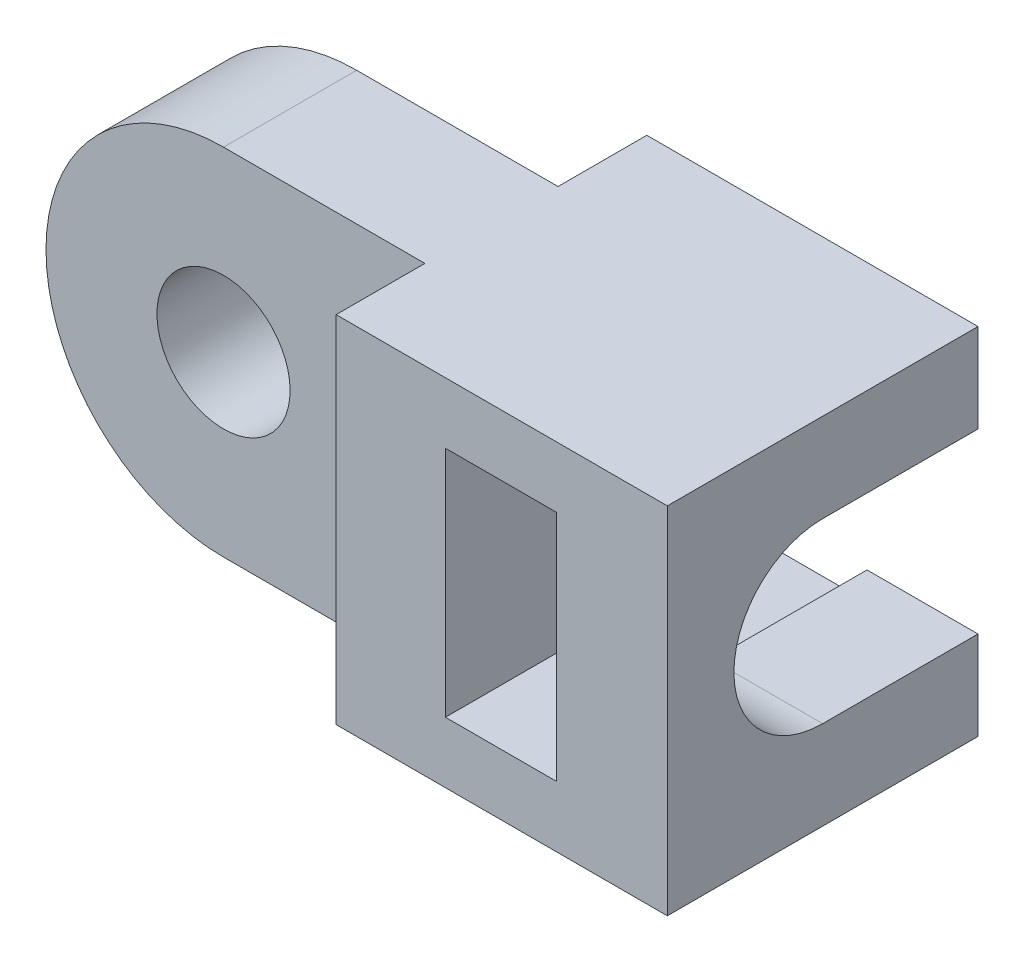
ISO-10303-21;
HEADER;
FILE_DESCRIPTION(('STEP AP214'),'2;1');
FILE_NAME('part.step','',(''),(''),'','','');
FILE_SCHEMA(('AUTOMOTIVE_DESIGN { 1 0 10303 214 1 1 1 1 }'));
ENDSEC;
DATA;
#1=APPLICATION_CONTEXT('core data for automotive mechanical design processes');
#2=APPLICATION_PROTOCOL_DEFINITION('international standard','automotive_design',2000,#1);
#3=PRODUCT_CONTEXT('',#1,'mechanical');
#4=PRODUCT('Part','Part','',(#3));
#5=PRODUCT_RELATED_PRODUCT_CATEGORY('part','',(#4));
#6=PRODUCT_DEFINITION_FORMATION('','',#4);
#7=PRODUCT_DEFINITION_CONTEXT('part definition',#1,'design');
#8=PRODUCT_DEFINITION('design','',#6,#7);
#9=PRODUCT_DEFINITION_SHAPE('','',#8);
#10=(LENGTH_UNIT() NAMED_UNIT(*) SI_UNIT(.MILLI.,.METRE.));
#11=(NAMED_UNIT(*) PLANE_ANGLE_UNIT() SI_UNIT($,.RADIAN.));
#12=(NAMED_UNIT(*) SI_UNIT($,.STERADIAN.) SOLID_ANGLE_UNIT());
#13=UNCERTAINTY_MEASURE_WITH_UNIT(LENGTH_MEASURE(1.E-05),#10,'distance_accuracy_value','');
#14=(GEOMETRIC_REPRESENTATION_CONTEXT(3) GLOBAL_UNCERTAINTY_ASSIGNED_CONTEXT((#13)) GLOBAL_UNIT_ASSIGNED_CONTEXT((#10,
#11,#12)) REPRESENTATION_CONTEXT('',''));
#15=CARTESIAN_POINT('',(0.,0.,0.));
#16=DIRECTION('',(0.,0.,1.));
#17=DIRECTION('',(1.,0.,0.));
#18=AXIS2_PLACEMENT_3D('',#15,#16,#17);
#19=CARTESIAN_POINT('',(0.,0.,-3.5));
#20=DIRECTION('',(0.,0.,1.));
#21=DIRECTION('',(1.,0.,0.));
#22=AXIS2_PLACEMENT_3D('',#19,#20,#21);
#23=PLANE('',#22);
#24=DIRECTION('',(0.,-1.,0.));
#25=VECTOR('',#24,1.);
#26=CARTESIAN_POINT('',(9.5,0.,-3.5));
#27=LINE('',#26,#25);
#28=CARTESIAN_POINT('',(9.5,-2.,-3.5));
#29=VERTEX_POINT('',#28);
#30=CARTESIAN_POINT('',(9.5,-2.625,-3.5));
#31=VERTEX_POINT('',#30);
#32=EDGE_CURVE('E264',#29,#31,#27,.T.);
#33=ORIENTED_EDGE('',*,*,#32,.F.);
#34=DIRECTION('',(-1.,0.,0.));
#35=VECTOR('',#34,1.);
#36=CARTESIAN_POINT('',(14.5,-2.,-3.5));
#37=LINE('',#36,#35);
#38=CARTESIAN_POINT('',(12.,-2.,-3.5));
#39=VERTEX_POINT('',#38);
#40=EDGE_CURVE('E166',#39,#29,#37,.T.);
#41=ORIENTED_EDGE('',*,*,#40,.F.);
#42=DIRECTION('',(0.,1.,0.));
#43=VECTOR('',#42,1.);
#44=CARTESIAN_POINT('',(12.,-4.,-3.5));
#45=LINE('',#44,#43);
#46=CARTESIAN_POINT('',(12.,-4.,-3.5));
#47=VERTEX_POINT('',#46);
#48=EDGE_CURVE('E250',#47,#39,#45,.T.);
#49=ORIENTED_EDGE('',*,*,#48,.F.);
#50=DIRECTION('',(1.,0.,0.));
#51=VECTOR('',#50,1.);
#52=CARTESIAN_POINT('',(12.,-4.,-3.5));
#53=LINE('',#52,#51);
#54=CARTESIAN_POINT('',(4.53690947743723,-4.,-3.5));
#55=VERTEX_POINT('',#54);
#56=EDGE_CURVE('E240',#55,#47,#53,.T.);
#57=ORIENTED_EDGE('',*,*,#56,.F.);
#58=DIRECTION('',(0.,-1.,0.));
#59=VECTOR('',#58,1.);
#60=CARTESIAN_POINT('',(4.53690947743723,-4.,-3.5));
#61=LINE('',#60,#59);
#62=CARTESIAN_POINT('',(4.53690947743723,4.,-3.5));
#63=VERTEX_POINT('',#62);
#64=EDGE_CURVE('E244',#63,#55,#61,.T.);
#65=ORIENTED_EDGE('',*,*,#64,.F.);
#66=DIRECTION('',(-1.,0.,0.));
#67=VECTOR('',#66,1.);
#68=CARTESIAN_POINT('',(12.,4.,-3.5));
#69=LINE('',#68,#67);
#70=CARTESIAN_POINT('',(12.,4.,-3.5));
#71=VERTEX_POINT('',#70);
#72=EDGE_CURVE('E247',#71,#63,#69,.T.);
#73=ORIENTED_EDGE('',*,*,#72,.F.);
#74=CARTESIAN_POINT('',(12.,2.,-3.5));
#75=VERTEX_POINT('',#74);
#76=EDGE_CURVE('E253',#75,#71,#45,.T.);
#77=ORIENTED_EDGE('',*,*,#76,.F.);
#78=DIRECTION('',(1.,0.,0.));
#79=VECTOR('',#78,1.);
#80=CARTESIAN_POINT('',(14.5,2.,-3.5));
#81=LINE('',#80,#79);
#82=CARTESIAN_POINT('',(9.5,2.,-3.5));
#83=VERTEX_POINT('',#82);
#84=EDGE_CURVE('E282',#83,#75,#81,.T.);
#85=ORIENTED_EDGE('',*,*,#84,.F.);
#86=CARTESIAN_POINT('',(9.5,2.625,-3.5));
#87=VERTEX_POINT('',#86);
#88=EDGE_CURVE('E175',#87,#83,#27,.T.);
#89=ORIENTED_EDGE('',*,*,#88,.F.);
#90=DIRECTION('',(1.,0.,0.));
#91=VECTOR('',#90,1.);
#92=CARTESIAN_POINT('',(0.,2.625,-3.5));
#93=LINE('',#92,#91);
#94=CARTESIAN_POINT('',(7.,2.625,-3.5));
#95=VERTEX_POINT('',#94);
#96=EDGE_CURVE('E265',#95,#87,#93,.T.);
#97=ORIENTED_EDGE('',*,*,#96,.F.);
#98=DIRECTION('',(0.,1.,0.));
#99=VECTOR('',#98,1.);
#100=CARTESIAN_POINT('',(7.,0.,-3.5));
#101=LINE('',#100,#99);
#102=CARTESIAN_POINT('',(7.,-2.625,-3.5));
#103=VERTEX_POINT('',#102);
#104=EDGE_CURVE('E267',#103,#95,#101,.T.);
#105=ORIENTED_EDGE('',*,*,#104,.F.);
#106=DIRECTION('',(-1.,0.,0.));
#107=VECTOR('',#106,1.);
#108=CARTESIAN_POINT('',(0.,-2.625,-3.5));
#109=LINE('',#108,#107);
#110=EDGE_CURVE('E269',#31,#103,#109,.T.);
#111=ORIENTED_EDGE('',*,*,#110,.F.);
#112=EDGE_LOOP('',(#33,#41,#49,#57,#65,#73,#77,#85,#89,#97,#105,#111));
#113=FACE_BOUND('',#112,.T.);
#114=ADVANCED_FACE('F48',(#113),#23,.F.);
#115=CARTESIAN_POINT('',(0.,0.,3.5));
#116=DIRECTION('',(0.,0.,1.));
#117=DIRECTION('',(1.,0.,0.));
#118=AXIS2_PLACEMENT_3D('',#115,#116,#117);
#119=PLANE('',#118);
#120=DIRECTION('',(0.,1.,0.));
#121=VECTOR('',#120,1.);
#122=CARTESIAN_POINT('',(12.,-4.,3.5));
#123=LINE('',#122,#121);
#124=CARTESIAN_POINT('',(12.,-4.,3.5));
#125=VERTEX_POINT('',#124);
#126=CARTESIAN_POINT('',(12.,4.,3.5));
#127=VERTEX_POINT('',#126);
#128=EDGE_CURVE('E243',#125,#127,#123,.T.);
#129=ORIENTED_EDGE('',*,*,#128,.T.);
#130=DIRECTION('',(-1.,0.,0.));
#131=VECTOR('',#130,1.);
#132=CARTESIAN_POINT('',(12.,4.,3.5));
#133=LINE('',#132,#131);
#134=CARTESIAN_POINT('',(4.53690947743723,4.,3.5));
#135=VERTEX_POINT('',#134);
#136=EDGE_CURVE('E259',#127,#135,#133,.T.);
#137=ORIENTED_EDGE('',*,*,#136,.T.);
#138=DIRECTION('',(0.,-1.,0.));
#139=VECTOR('',#138,1.);
#140=CARTESIAN_POINT('',(4.53690947743723,-4.,3.5));
#141=LINE('',#140,#139);
#142=CARTESIAN_POINT('',(4.53690947743723,-4.,3.5));
#143=VERTEX_POINT('',#142);
#144=EDGE_CURVE('E257',#135,#143,#141,.T.);
#145=ORIENTED_EDGE('',*,*,#144,.T.);
#146=DIRECTION('',(1.,0.,0.));
#147=VECTOR('',#146,1.);
#148=CARTESIAN_POINT('',(12.,-4.,3.5));
#149=LINE('',#148,#147);
#150=EDGE_CURVE('E254',#143,#125,#149,.T.);
#151=ORIENTED_EDGE('',*,*,#150,.T.);
#152=EDGE_LOOP('',(#129,#137,#145,#151));
#153=FACE_BOUND('',#152,.T.);
#154=DIRECTION('',(1.,0.,0.));
#155=VECTOR('',#154,1.);
#156=CARTESIAN_POINT('',(0.,2.625,3.5));
#157=LINE('',#156,#155);
#158=CARTESIAN_POINT('',(7.,2.625,3.5));
#159=VERTEX_POINT('',#158);
#160=CARTESIAN_POINT('',(9.5,2.625,3.5));
#161=VERTEX_POINT('',#160);
#162=EDGE_CURVE('E188',#159,#161,#157,.T.);
#163=ORIENTED_EDGE('',*,*,#162,.T.);
#164=DIRECTION('',(0.,-1.,0.));
#165=VECTOR('',#164,1.);
#166=CARTESIAN_POINT('',(9.5,0.,3.5));
#167=LINE('',#166,#165);
#168=CARTESIAN_POINT('',(9.5,-2.625,3.5));
#169=VERTEX_POINT('',#168);
#170=EDGE_CURVE('E56',#161,#169,#167,.T.);
#171=ORIENTED_EDGE('',*,*,#170,.T.);
#172=DIRECTION('',(-1.,0.,0.));
#173=VECTOR('',#172,1.);
#174=CARTESIAN_POINT('',(0.,-2.625,3.5));
#175=LINE('',#174,#173);
#176=CARTESIAN_POINT('',(7.,-2.625,3.5));
#177=VERTEX_POINT('',#176);
#178=EDGE_CURVE('E194',#169,#177,#175,.T.);
#179=ORIENTED_EDGE('',*,*,#178,.T.);
#180=DIRECTION('',(0.,1.,0.));
#181=VECTOR('',#180,1.);
#182=CARTESIAN_POINT('',(7.,0.,3.5));
#183=LINE('',#182,#181);
#184=EDGE_CURVE('E191',#177,#159,#183,.T.);
#185=ORIENTED_EDGE('',*,*,#184,.T.);
#186=EDGE_LOOP('',(#163,#171,#179,#185));
#187=FACE_BOUND('',#186,.T.);
#188=ADVANCED_FACE('F299',(#153,#187),#119,.T.);
#189=CARTESIAN_POINT('',(0.,0.,1.5));
#190=DIRECTION('',(0.,0.,1.));
#191=DIRECTION('',(1.,0.,0.));
#192=AXIS2_PLACEMENT_3D('',#189,#190,#191);
#193=PLANE('',#192);
#194=CARTESIAN_POINT('',(0.,0.,1.5));
#195=DIRECTION('',(0.,0.,1.));
#196=DIRECTION('',(1.,0.,0.));
#197=AXIS2_PLACEMENT_3D('',#194,#195,#196);
#198=CIRCLE('',#197,1.5);
#199=CARTESIAN_POINT('',(1.5,0.,1.5));
#200=VERTEX_POINT('',#199);
#201=EDGE_CURVE('E209',#200,#200,#198,.T.);
#202=ORIENTED_EDGE('',*,*,#201,.F.);
#203=EDGE_LOOP('',(#202));
#204=FACE_BOUND('',#203,.T.);
#205=DIRECTION('',(1.,0.,0.));
#206=VECTOR('',#205,1.);
#207=CARTESIAN_POINT('',(0.,-4.,1.5));
#208=LINE('',#207,#206);
#209=CARTESIAN_POINT('',(0.,-4.,1.5));
#210=VERTEX_POINT('',#209);
#211=CARTESIAN_POINT('',(4.53690947743723,-4.,1.5));
#212=VERTEX_POINT('',#211);
#213=EDGE_CURVE('E225',#210,#212,#208,.T.);
#214=ORIENTED_EDGE('',*,*,#213,.T.);
#215=DIRECTION('',(0.,1.,0.));
#216=VECTOR('',#215,1.);
#217=CARTESIAN_POINT('',(4.53690947743723,0.,1.5));
#218=LINE('',#217,#216);
#219=CARTESIAN_POINT('',(4.53690947743723,4.,1.5));
#220=VERTEX_POINT('',#219);
#221=EDGE_CURVE('E222',#212,#220,#218,.T.);
#222=ORIENTED_EDGE('',*,*,#221,.T.);
#223=DIRECTION('',(1.,0.,0.));
#224=VECTOR('',#223,1.);
#225=CARTESIAN_POINT('',(0.,4.,1.5));
#226=LINE('',#225,#224);
#227=CARTESIAN_POINT('',(0.,4.,1.5));
#228=VERTEX_POINT('',#227);
#229=EDGE_CURVE('E213',#228,#220,#226,.T.);
#230=ORIENTED_EDGE('',*,*,#229,.F.);
#231=CARTESIAN_POINT('',(0.,0.,1.5));
#232=DIRECTION('',(0.,0.,1.));
#233=DIRECTION('',(1.,0.,0.));
#234=AXIS2_PLACEMENT_3D('',#231,#232,#233);
#235=CIRCLE('',#234,4.);
#236=EDGE_CURVE('E227',#228,#210,#235,.T.);
#237=ORIENTED_EDGE('',*,*,#236,.T.);
#238=EDGE_LOOP('',(#214,#222,#230,#237));
#239=FACE_BOUND('',#238,.T.);
#240=ADVANCED_FACE('F337',(#204,#239),#193,.T.);
#241=CARTESIAN_POINT('',(0.,0.,-1.5));
#242=DIRECTION('',(0.,0.,1.));
#243=DIRECTION('',(1.,0.,0.));
#244=AXIS2_PLACEMENT_3D('',#241,#242,#243);
#245=PLANE('',#244);
#246=CARTESIAN_POINT('',(0.,0.,-1.5));
#247=DIRECTION('',(0.,0.,1.));
#248=DIRECTION('',(1.,0.,0.));
#249=AXIS2_PLACEMENT_3D('',#246,#247,#248);
#250=CIRCLE('',#249,1.5);
#251=CARTESIAN_POINT('',(1.5,0.,-1.5));
#252=VERTEX_POINT('',#251);
#253=EDGE_CURVE('E210',#252,#252,#250,.T.);
#254=ORIENTED_EDGE('',*,*,#253,.T.);
#255=EDGE_LOOP('',(#254));
#256=FACE_BOUND('',#255,.T.);
#257=DIRECTION('',(0.,1.,0.));
#258=VECTOR('',#257,1.);
#259=CARTESIAN_POINT('',(4.53690947743723,0.,-1.5));
#260=LINE('',#259,#258);
#261=CARTESIAN_POINT('',(4.53690947743723,-4.,-1.5));
#262=VERTEX_POINT('',#261);
#263=CARTESIAN_POINT('',(4.53690947743723,4.,-1.5));
#264=VERTEX_POINT('',#263);
#265=EDGE_CURVE('E197',#262,#264,#260,.T.);
#266=ORIENTED_EDGE('',*,*,#265,.F.);
#267=DIRECTION('',(1.,0.,0.));
#268=VECTOR('',#267,1.);
#269=CARTESIAN_POINT('',(0.,-4.,-1.5));
#270=LINE('',#269,#268);
#271=CARTESIAN_POINT('',(0.,-4.,-1.5));
#272=VERTEX_POINT('',#271);
#273=EDGE_CURVE('E214',#272,#262,#270,.T.);
#274=ORIENTED_EDGE('',*,*,#273,.F.);
#275=CARTESIAN_POINT('',(0.,0.,-1.5));
#276=DIRECTION('',(0.,0.,1.));
#277=DIRECTION('',(1.,0.,0.));
#278=AXIS2_PLACEMENT_3D('',#275,#276,#277);
#279=CIRCLE('',#278,4.);
#280=CARTESIAN_POINT('',(0.,4.,-1.5));
#281=VERTEX_POINT('',#280);
#282=EDGE_CURVE('E217',#281,#272,#279,.T.);
#283=ORIENTED_EDGE('',*,*,#282,.F.);
#284=DIRECTION('',(1.,0.,0.));
#285=VECTOR('',#284,1.);
#286=CARTESIAN_POINT('',(0.,4.,-1.5));
#287=LINE('',#286,#285);
#288=EDGE_CURVE('E219',#281,#264,#287,.T.);
#289=ORIENTED_EDGE('',*,*,#288,.T.);
#290=EDGE_LOOP('',(#266,#274,#283,#289));
#291=FACE_BOUND('',#290,.T.);
#292=ADVANCED_FACE('F346',(#256,#291),#245,.F.);
#293=CARTESIAN_POINT('',(0.,4.,1.5));
#294=DIRECTION('',(0.,1.,0.));
#295=DIRECTION('',(-1.,0.,0.));
#296=AXIS2_PLACEMENT_3D('',#293,#294,#295);
#297=PLANE('',#296);
#298=DIRECTION('',(0.,0.,-1.));
#299=VECTOR('',#298,1.);
#300=CARTESIAN_POINT('',(4.53690947743723,4.,3.5));
#301=LINE('',#300,#299);
#302=EDGE_CURVE('E235',#264,#63,#301,.T.);
#303=ORIENTED_EDGE('',*,*,#302,.F.);
#304=ORIENTED_EDGE('',*,*,#288,.F.);
#305=DIRECTION('',(0.,0.,-1.));
#306=VECTOR('',#305,1.);
#307=CARTESIAN_POINT('',(0.,4.,1.5));
#308=LINE('',#307,#306);
#309=EDGE_CURVE('E199',#228,#281,#308,.T.);
#310=ORIENTED_EDGE('',*,*,#309,.F.);
#311=ORIENTED_EDGE('',*,*,#229,.T.);
#312=EDGE_CURVE('E232',#135,#220,#301,.T.);
#313=ORIENTED_EDGE('',*,*,#312,.F.);
#314=ORIENTED_EDGE('',*,*,#136,.F.);
#315=DIRECTION('',(0.,0.,-1.));
#316=VECTOR('',#315,1.);
#317=CARTESIAN_POINT('',(12.,4.,1.5));
#318=LINE('',#317,#316);
#319=EDGE_CURVE('E206',#127,#71,#318,.T.);
#320=ORIENTED_EDGE('',*,*,#319,.T.);
#321=ORIENTED_EDGE('',*,*,#72,.T.);
#322=EDGE_LOOP('',(#303,#304,#310,#311,#313,#314,#320,#321));
#323=FACE_BOUND('',#322,.T.);
#324=ADVANCED_FACE('F50',(#323),#297,.T.);
#325=CARTESIAN_POINT('',(0.,0.,1.5));
#326=DIRECTION('',(0.,0.,-1.));
#327=DIRECTION('',(-1.,0.,0.));
#328=AXIS2_PLACEMENT_3D('',#325,#326,#327);
#329=CYLINDRICAL_SURFACE('',#328,4.);
#330=ORIENTED_EDGE('',*,*,#282,.T.);
#331=DIRECTION('',(0.,0.,-1.));
#332=VECTOR('',#331,1.);
#333=CARTESIAN_POINT('',(0.,-4.,1.5));
#334=LINE('',#333,#332);
#335=EDGE_CURVE('E201',#210,#272,#334,.T.);
#336=ORIENTED_EDGE('',*,*,#335,.F.);
#337=ORIENTED_EDGE('',*,*,#236,.F.);
#338=ORIENTED_EDGE('',*,*,#309,.T.);
#339=EDGE_LOOP('',(#330,#336,#337,#338));
#340=FACE_BOUND('',#339,.T.);
#341=ADVANCED_FACE('F358',(#340),#329,.T.);
#342=CARTESIAN_POINT('',(0.,-4.,1.5));
#343=DIRECTION('',(0.,1.,0.));
#344=DIRECTION('',(0.,0.,1.));
#345=AXIS2_PLACEMENT_3D('',#342,#343,#344);
#346=PLANE('',#345);
#347=DIRECTION('',(0.,0.,-1.));
#348=VECTOR('',#347,1.);
#349=CARTESIAN_POINT('',(12.,-4.,1.5));
#350=LINE('',#349,#348);
#351=EDGE_CURVE('E204',#125,#47,#350,.T.);
#352=ORIENTED_EDGE('',*,*,#351,.F.);
#353=ORIENTED_EDGE('',*,*,#150,.F.);
#354=DIRECTION('',(0.,0.,-1.));
#355=VECTOR('',#354,1.);
#356=CARTESIAN_POINT('',(4.53690947743723,-4.,3.5));
#357=LINE('',#356,#355);
#358=EDGE_CURVE('E236',#143,#212,#357,.T.);
#359=ORIENTED_EDGE('',*,*,#358,.T.);
#360=ORIENTED_EDGE('',*,*,#213,.F.);
#361=ORIENTED_EDGE('',*,*,#335,.T.);
#362=ORIENTED_EDGE('',*,*,#273,.T.);
#363=EDGE_CURVE('E239',#262,#55,#357,.T.);
#364=ORIENTED_EDGE('',*,*,#363,.T.);
#365=ORIENTED_EDGE('',*,*,#56,.T.);
#366=EDGE_LOOP('',(#352,#353,#359,#360,#361,#362,#364,#365));
#367=FACE_BOUND('',#366,.T.);
#368=ADVANCED_FACE('F305',(#367),#346,.F.);
#369=CARTESIAN_POINT('',(12.,0.,1.5));
#370=DIRECTION('',(1.,0.,0.));
#371=DIRECTION('',(0.,1.,0.));
#372=AXIS2_PLACEMENT_3D('',#369,#370,#371);
#373=PLANE('',#372);
#374=DIRECTION('',(0.,0.,-1.));
#375=VECTOR('',#374,1.);
#376=CARTESIAN_POINT('',(12.,-2.,1.5));
#377=LINE('',#376,#375);
#378=CARTESIAN_POINT('',(12.,-2.,0.));
#379=VERTEX_POINT('',#378);
#380=EDGE_CURVE('E183',#379,#39,#377,.T.);
#381=ORIENTED_EDGE('',*,*,#380,.F.);
#382=CARTESIAN_POINT('',(12.,0.,0.));
#383=DIRECTION('',(1.,0.,0.));
#384=DIRECTION('',(0.,1.,0.));
#385=AXIS2_PLACEMENT_3D('',#382,#383,#384);
#386=CIRCLE('',#385,2.);
#387=CARTESIAN_POINT('',(12.,2.,0.));
#388=VERTEX_POINT('',#387);
#389=EDGE_CURVE('E179',#388,#379,#386,.T.);
#390=ORIENTED_EDGE('',*,*,#389,.F.);
#391=DIRECTION('',(0.,0.,1.));
#392=VECTOR('',#391,1.);
#393=CARTESIAN_POINT('',(12.,2.,1.5));
#394=LINE('',#393,#392);
#395=EDGE_CURVE('E63',#75,#388,#394,.T.);
#396=ORIENTED_EDGE('',*,*,#395,.F.);
#397=ORIENTED_EDGE('',*,*,#76,.T.);
#398=ORIENTED_EDGE('',*,*,#319,.F.);
#399=ORIENTED_EDGE('',*,*,#128,.F.);
#400=ORIENTED_EDGE('',*,*,#351,.T.);
#401=ORIENTED_EDGE('',*,*,#48,.T.);
#402=EDGE_LOOP('',(#381,#390,#396,#397,#398,#399,#400,#401));
#403=FACE_BOUND('',#402,.T.);
#404=ADVANCED_FACE('F287',(#403),#373,.T.);
#405=CARTESIAN_POINT('',(0.,0.,1.5));
#406=DIRECTION('',(0.,0.,-1.));
#407=DIRECTION('',(-1.,0.,0.));
#408=AXIS2_PLACEMENT_3D('',#405,#406,#407);
#409=CYLINDRICAL_SURFACE('',#408,1.5);
#410=ORIENTED_EDGE('',*,*,#201,.T.);
#411=EDGE_LOOP('',(#410));
#412=FACE_BOUND('',#411,.T.);
#413=ORIENTED_EDGE('',*,*,#253,.F.);
#414=EDGE_LOOP('',(#413));
#415=FACE_BOUND('',#414,.T.);
#416=ADVANCED_FACE('F351',(#412,#415),#409,.F.);
#417=CARTESIAN_POINT('',(4.53690947743723,-4.,3.5));
#418=DIRECTION('',(1.,0.,0.));
#419=DIRECTION('',(0.,0.,-1.));
#420=AXIS2_PLACEMENT_3D('',#417,#418,#419);
#421=PLANE('',#420);
#422=ORIENTED_EDGE('',*,*,#363,.F.);
#423=ORIENTED_EDGE('',*,*,#265,.T.);
#424=ORIENTED_EDGE('',*,*,#302,.T.);
#425=ORIENTED_EDGE('',*,*,#64,.T.);
#426=EDGE_LOOP('',(#422,#423,#424,#425));
#427=FACE_BOUND('',#426,.T.);
#428=ADVANCED_FACE('F342',(#427),#421,.F.);
#429=ORIENTED_EDGE('',*,*,#221,.F.);
#430=ORIENTED_EDGE('',*,*,#358,.F.);
#431=ORIENTED_EDGE('',*,*,#144,.F.);
#432=ORIENTED_EDGE('',*,*,#312,.T.);
#433=EDGE_LOOP('',(#429,#430,#431,#432));
#434=FACE_BOUND('',#433,.T.);
#435=ADVANCED_FACE('F330',(#434),#421,.F.);
#436=CARTESIAN_POINT('',(9.5,2.625,8.5));
#437=DIRECTION('',(-1.,0.,0.));
#438=DIRECTION('',(0.,0.,1.));
#439=AXIS2_PLACEMENT_3D('',#436,#437,#438);
#440=PLANE('',#439);
#441=DIRECTION('',(0.,0.,-1.));
#442=VECTOR('',#441,1.);
#443=CARTESIAN_POINT('',(9.5,-2.,0.));
#444=LINE('',#443,#442);
#445=CARTESIAN_POINT('',(9.5,-2.,0.));
#446=VERTEX_POINT('',#445);
#447=EDGE_CURVE('E71',#446,#29,#444,.T.);
#448=ORIENTED_EDGE('',*,*,#447,.T.);
#449=ORIENTED_EDGE('',*,*,#32,.T.);
#450=DIRECTION('',(0.,0.,-1.));
#451=VECTOR('',#450,1.);
#452=CARTESIAN_POINT('',(9.5,-2.625,8.5));
#453=LINE('',#452,#451);
#454=EDGE_CURVE('E178',#169,#31,#453,.T.);
#455=ORIENTED_EDGE('',*,*,#454,.F.);
#456=ORIENTED_EDGE('',*,*,#170,.F.);
#457=DIRECTION('',(0.,0.,-1.));
#458=VECTOR('',#457,1.);
#459=CARTESIAN_POINT('',(9.5,2.625,8.5));
#460=LINE('',#459,#458);
#461=EDGE_CURVE('E271',#161,#87,#460,.T.);
#462=ORIENTED_EDGE('',*,*,#461,.T.);
#463=ORIENTED_EDGE('',*,*,#88,.T.);
#464=DIRECTION('',(0.,0.,-1.));
#465=VECTOR('',#464,1.);
#466=CARTESIAN_POINT('',(9.5,2.,0.));
#467=LINE('',#466,#465);
#468=CARTESIAN_POINT('',(9.5,2.,0.));
#469=VERTEX_POINT('',#468);
#470=EDGE_CURVE('E160',#469,#83,#467,.T.);
#471=ORIENTED_EDGE('',*,*,#470,.F.);
#472=CARTESIAN_POINT('',(9.5,0.,0.));
#473=DIRECTION('',(-1.,0.,0.));
#474=DIRECTION('',(0.,0.,1.));
#475=AXIS2_PLACEMENT_3D('',#472,#473,#474);
#476=CIRCLE('',#475,2.);
#477=EDGE_CURVE('E172',#446,#469,#476,.T.);
#478=ORIENTED_EDGE('',*,*,#477,.F.);
#479=EDGE_LOOP('',(#448,#449,#455,#456,#462,#463,#471,#478));
#480=FACE_BOUND('',#479,.T.);
#481=ADVANCED_FACE('F171',(#480),#440,.T.);
#482=CARTESIAN_POINT('',(7.,2.625,8.5));
#483=DIRECTION('',(0.,-1.,0.));
#484=DIRECTION('',(0.,0.,-1.));
#485=AXIS2_PLACEMENT_3D('',#482,#483,#484);
#486=PLANE('',#485);
#487=ORIENTED_EDGE('',*,*,#96,.T.);
#488=ORIENTED_EDGE('',*,*,#461,.F.);
#489=ORIENTED_EDGE('',*,*,#162,.F.);
#490=DIRECTION('',(0.,0.,-1.));
#491=VECTOR('',#490,1.);
#492=CARTESIAN_POINT('',(7.,2.625,8.5));
#493=LINE('',#492,#491);
#494=EDGE_CURVE('E273',#159,#95,#493,.T.);
#495=ORIENTED_EDGE('',*,*,#494,.T.);
#496=EDGE_LOOP('',(#487,#488,#489,#495));
#497=FACE_BOUND('',#496,.T.);
#498=ADVANCED_FACE('F322',(#497),#486,.T.);
#499=CARTESIAN_POINT('',(7.,2.625,8.5));
#500=DIRECTION('',(1.,0.,0.));
#501=DIRECTION('',(0.,0.,-1.));
#502=AXIS2_PLACEMENT_3D('',#499,#500,#501);
#503=PLANE('',#502);
#504=ORIENTED_EDGE('',*,*,#104,.T.);
#505=ORIENTED_EDGE('',*,*,#494,.F.);
#506=ORIENTED_EDGE('',*,*,#184,.F.);
#507=DIRECTION('',(0.,0.,-1.));
#508=VECTOR('',#507,1.);
#509=CARTESIAN_POINT('',(7.,-2.625,8.5));
#510=LINE('',#509,#508);
#511=EDGE_CURVE('E181',#177,#103,#510,.T.);
#512=ORIENTED_EDGE('',*,*,#511,.T.);
#513=EDGE_LOOP('',(#504,#505,#506,#512));
#514=FACE_BOUND('',#513,.T.);
#515=ADVANCED_FACE('F318',(#514),#503,.T.);
#516=CARTESIAN_POINT('',(7.,-2.625,8.5));
#517=DIRECTION('',(0.,1.,0.));
#518=DIRECTION('',(0.,0.,1.));
#519=AXIS2_PLACEMENT_3D('',#516,#517,#518);
#520=PLANE('',#519);
#521=ORIENTED_EDGE('',*,*,#110,.T.);
#522=ORIENTED_EDGE('',*,*,#511,.F.);
#523=ORIENTED_EDGE('',*,*,#178,.F.);
#524=ORIENTED_EDGE('',*,*,#454,.T.);
#525=EDGE_LOOP('',(#521,#522,#523,#524));
#526=FACE_BOUND('',#525,.T.);
#527=ADVANCED_FACE('F315',(#526),#520,.T.);
#528=CARTESIAN_POINT('',(9.,0.,0.));
#529=DIRECTION('',(1.,0.,0.));
#530=DIRECTION('',(0.,1.,0.));
#531=AXIS2_PLACEMENT_3D('',#528,#529,#530);
#532=CYLINDRICAL_SURFACE('',#531,2.);
#533=ORIENTED_EDGE('',*,*,#389,.T.);
#534=DIRECTION('',(1.,0.,0.));
#535=VECTOR('',#534,1.);
#536=CARTESIAN_POINT('',(9.,-2.,0.));
#537=LINE('',#536,#535);
#538=EDGE_CURVE('E13',#379,#446,#537,.F.);
#539=ORIENTED_EDGE('',*,*,#538,.T.);
#540=ORIENTED_EDGE('',*,*,#477,.T.);
#541=DIRECTION('',(1.,0.,0.));
#542=VECTOR('',#541,1.);
#543=CARTESIAN_POINT('',(14.5,2.,0.));
#544=LINE('',#543,#542);
#545=EDGE_CURVE('E157',#469,#388,#544,.T.);
#546=ORIENTED_EDGE('',*,*,#545,.T.);
#547=EDGE_LOOP('',(#533,#539,#540,#546));
#548=FACE_BOUND('',#547,.T.);
#549=ADVANCED_FACE('F177',(#548),#532,.F.);
#550=CARTESIAN_POINT('',(14.5,2.,0.));
#551=DIRECTION('',(0.,1.,0.));
#552=DIRECTION('',(0.,0.,1.));
#553=AXIS2_PLACEMENT_3D('',#550,#551,#552);
#554=PLANE('',#553);
#555=ORIENTED_EDGE('',*,*,#395,.T.);
#556=ORIENTED_EDGE('',*,*,#545,.F.);
#557=ORIENTED_EDGE('',*,*,#470,.T.);
#558=ORIENTED_EDGE('',*,*,#84,.T.);
#559=EDGE_LOOP('',(#555,#556,#557,#558));
#560=FACE_BOUND('',#559,.T.);
#561=ADVANCED_FACE('F159',(#560),#554,.F.);
#562=CARTESIAN_POINT('',(14.5,-2.,0.));
#563=DIRECTION('',(0.,-1.,0.));
#564=DIRECTION('',(1.,0.,0.));
#565=AXIS2_PLACEMENT_3D('',#562,#563,#564);
#566=PLANE('',#565);
#567=ORIENTED_EDGE('',*,*,#380,.T.);
#568=ORIENTED_EDGE('',*,*,#40,.T.);
#569=ORIENTED_EDGE('',*,*,#447,.F.);
#570=ORIENTED_EDGE('',*,*,#538,.F.);
#571=EDGE_LOOP('',(#567,#568,#569,#570));
#572=FACE_BOUND('',#571,.T.);
#573=ADVANCED_FACE('F309',(#572),#566,.F.);
#574=CLOSED_SHELL('',(#114,#188,#240,#292,#324,#341,#368,#404,#416,#428,#435,#481,#498,#515,
#527,#549,#561,#573));
#575=MANIFOLD_SOLID_BREP('B2',#574);
#576=ADVANCED_BREP_SHAPE_REPRESENTATION('',(#18,#575),#14);
#577=SHAPE_DEFINITION_REPRESENTATION(#9,#576);
ENDSEC;
END-ISO-10303-21;
